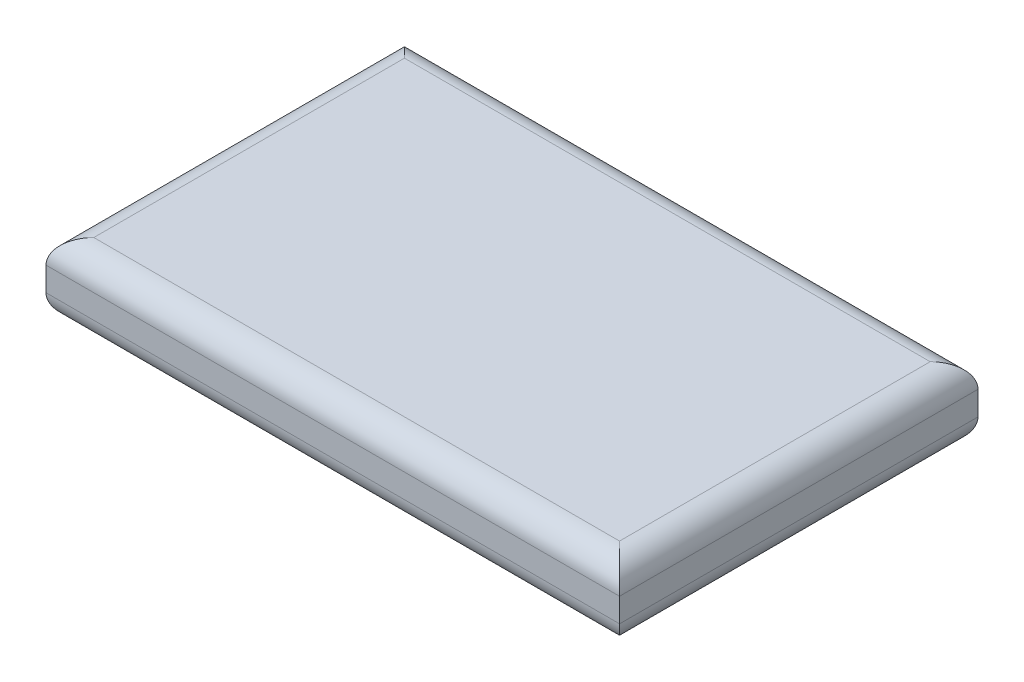
ISO-10303-21;
HEADER;
FILE_DESCRIPTION(('STEP AP214'),'2;1');
FILE_NAME('part.step','',(''),(''),'','','');
FILE_SCHEMA(('AUTOMOTIVE_DESIGN { 1 0 10303 214 1 1 1 1 }'));
ENDSEC;
DATA;
#1=APPLICATION_CONTEXT('core data for automotive mechanical design processes');
#2=APPLICATION_PROTOCOL_DEFINITION('international standard','automotive_design',2000,#1);
#3=PRODUCT_CONTEXT('',#1,'mechanical');
#4=PRODUCT('Part','Part','',(#3));
#5=PRODUCT_RELATED_PRODUCT_CATEGORY('part','',(#4));
#6=PRODUCT_DEFINITION_FORMATION('','',#4);
#7=PRODUCT_DEFINITION_CONTEXT('part definition',#1,'design');
#8=PRODUCT_DEFINITION('design','',#6,#7);
#9=PRODUCT_DEFINITION_SHAPE('','',#8);
#10=(LENGTH_UNIT() NAMED_UNIT(*) SI_UNIT(.MILLI.,.METRE.));
#11=(NAMED_UNIT(*) PLANE_ANGLE_UNIT() SI_UNIT($,.RADIAN.));
#12=(NAMED_UNIT(*) SI_UNIT($,.STERADIAN.) SOLID_ANGLE_UNIT());
#13=UNCERTAINTY_MEASURE_WITH_UNIT(LENGTH_MEASURE(1.E-05),#10,'distance_accuracy_value','');
#14=(GEOMETRIC_REPRESENTATION_CONTEXT(3) GLOBAL_UNCERTAINTY_ASSIGNED_CONTEXT((#13)) GLOBAL_UNIT_ASSIGNED_CONTEXT((#10,
#11,#12)) REPRESENTATION_CONTEXT('',''));
#15=CARTESIAN_POINT('',(0.,0.,0.));
#16=DIRECTION('',(0.,0.,1.));
#17=DIRECTION('',(1.,0.,0.));
#18=AXIS2_PLACEMENT_3D('',#15,#16,#17);
#19=CARTESIAN_POINT('',(24.1258100601357,6.,15.870928548737));
#20=DIRECTION('',(-1.,0.,0.));
#21=DIRECTION('',(0.,0.,1.));
#22=AXIS2_PLACEMENT_3D('',#19,#20,#21);
#23=PLANE('',#22);
#24=DIRECTION('',(0.,-1.,0.));
#25=VECTOR('',#24,1.);
#26=CARTESIAN_POINT('',(24.1258100601357,6.,15.870928548737));
#27=LINE('',#26,#25);
#28=CARTESIAN_POINT('',(24.1258100601357,4.,15.870928548737));
#29=VERTEX_POINT('',#28);
#30=CARTESIAN_POINT('',(24.1258100601357,2.,15.870928548737));
#31=VERTEX_POINT('',#30);
#32=EDGE_CURVE('E142',#29,#31,#27,.T.);
#33=ORIENTED_EDGE('',*,*,#32,.T.);
#34=DIRECTION('',(0.,0.,-1.));
#35=VECTOR('',#34,1.);
#36=CARTESIAN_POINT('',(24.1258100601357,2.,15.870928548737));
#37=LINE('',#36,#35);
#38=CARTESIAN_POINT('',(24.1258100601357,2.,-14.129071451263));
#39=VERTEX_POINT('',#38);
#40=EDGE_CURVE('E151',#31,#39,#37,.T.);
#41=ORIENTED_EDGE('',*,*,#40,.T.);
#42=DIRECTION('',(0.,-1.,0.));
#43=VECTOR('',#42,1.);
#44=CARTESIAN_POINT('',(24.1258100601357,6.,-14.129071451263));
#45=LINE('',#44,#43);
#46=CARTESIAN_POINT('',(24.1258100601357,4.,-14.129071451263));
#47=VERTEX_POINT('',#46);
#48=EDGE_CURVE('E120',#47,#39,#45,.T.);
#49=ORIENTED_EDGE('',*,*,#48,.F.);
#50=DIRECTION('',(0.,0.,-1.));
#51=VECTOR('',#50,1.);
#52=CARTESIAN_POINT('',(24.1258100601357,4.,15.870928548737));
#53=LINE('',#52,#51);
#54=EDGE_CURVE('E153',#47,#29,#53,.F.);
#55=ORIENTED_EDGE('',*,*,#54,.T.);
#56=EDGE_LOOP('',(#33,#41,#49,#55));
#57=FACE_BOUND('',#56,.T.);
#58=ADVANCED_FACE('F33',(#57),#23,.F.);
#59=CARTESIAN_POINT('',(24.1258100601357,6.,-14.129071451263));
#60=DIRECTION('',(0.,0.,1.));
#61=DIRECTION('',(1.,0.,0.));
#62=AXIS2_PLACEMENT_3D('',#59,#60,#61);
#63=PLANE('',#62);
#64=ORIENTED_EDGE('',*,*,#48,.T.);
#65=DIRECTION('',(-1.,0.,0.));
#66=VECTOR('',#65,1.);
#67=CARTESIAN_POINT('',(24.1258100601357,2.,-14.129071451263));
#68=LINE('',#67,#66);
#69=CARTESIAN_POINT('',(-23.8741899398643,2.,-14.129071451263));
#70=VERTEX_POINT('',#69);
#71=EDGE_CURVE('E119',#39,#70,#68,.T.);
#72=ORIENTED_EDGE('',*,*,#71,.T.);
#73=DIRECTION('',(0.,-1.,0.));
#74=VECTOR('',#73,1.);
#75=CARTESIAN_POINT('',(-23.8741899398643,6.,-14.129071451263));
#76=LINE('',#75,#74);
#77=CARTESIAN_POINT('',(-23.8741899398643,4.,-14.129071451263));
#78=VERTEX_POINT('',#77);
#79=EDGE_CURVE('E102',#78,#70,#76,.T.);
#80=ORIENTED_EDGE('',*,*,#79,.F.);
#81=DIRECTION('',(-1.,0.,0.));
#82=VECTOR('',#81,1.);
#83=CARTESIAN_POINT('',(24.1258100601357,4.,-14.129071451263));
#84=LINE('',#83,#82);
#85=EDGE_CURVE('E116',#78,#47,#84,.F.);
#86=ORIENTED_EDGE('',*,*,#85,.T.);
#87=EDGE_LOOP('',(#64,#72,#80,#86));
#88=FACE_BOUND('',#87,.T.);
#89=ADVANCED_FACE('F115',(#88),#63,.F.);
#90=CARTESIAN_POINT('',(-23.8741899398643,6.,15.870928548737));
#91=DIRECTION('',(1.,0.,0.));
#92=DIRECTION('',(0.,0.,-1.));
#93=AXIS2_PLACEMENT_3D('',#90,#91,#92);
#94=PLANE('',#93);
#95=ORIENTED_EDGE('',*,*,#79,.T.);
#96=DIRECTION('',(0.,0.,1.));
#97=VECTOR('',#96,1.);
#98=CARTESIAN_POINT('',(-23.8741899398643,2.,15.870928548737));
#99=LINE('',#98,#97);
#100=CARTESIAN_POINT('',(-23.8741899398643,2.,15.870928548737));
#101=VERTEX_POINT('',#100);
#102=EDGE_CURVE('E108',#70,#101,#99,.T.);
#103=ORIENTED_EDGE('',*,*,#102,.T.);
#104=DIRECTION('',(0.,-1.,0.));
#105=VECTOR('',#104,1.);
#106=CARTESIAN_POINT('',(-23.8741899398643,6.,15.870928548737));
#107=LINE('',#106,#105);
#108=CARTESIAN_POINT('',(-23.8741899398643,4.,15.870928548737));
#109=VERTEX_POINT('',#108);
#110=EDGE_CURVE('E104',#109,#101,#107,.T.);
#111=ORIENTED_EDGE('',*,*,#110,.F.);
#112=DIRECTION('',(0.,0.,1.));
#113=VECTOR('',#112,1.);
#114=CARTESIAN_POINT('',(-23.8741899398643,4.,-14.129071451263));
#115=LINE('',#114,#113);
#116=EDGE_CURVE('E99',#109,#78,#115,.F.);
#117=ORIENTED_EDGE('',*,*,#116,.T.);
#118=EDGE_LOOP('',(#95,#103,#111,#117));
#119=FACE_BOUND('',#118,.T.);
#120=ADVANCED_FACE('F101',(#119),#94,.F.);
#121=CARTESIAN_POINT('',(24.1258100601357,6.,15.870928548737));
#122=DIRECTION('',(0.,0.,-1.));
#123=DIRECTION('',(-1.,0.,0.));
#124=AXIS2_PLACEMENT_3D('',#121,#122,#123);
#125=PLANE('',#124);
#126=ORIENTED_EDGE('',*,*,#110,.T.);
#127=DIRECTION('',(1.,0.,0.));
#128=VECTOR('',#127,1.);
#129=CARTESIAN_POINT('',(24.1258100601357,2.,15.870928548737));
#130=LINE('',#129,#128);
#131=EDGE_CURVE('E155',#101,#31,#130,.T.);
#132=ORIENTED_EDGE('',*,*,#131,.T.);
#133=ORIENTED_EDGE('',*,*,#32,.F.);
#134=DIRECTION('',(1.,0.,0.));
#135=VECTOR('',#134,1.);
#136=CARTESIAN_POINT('',(-23.8741899398643,4.,15.870928548737));
#137=LINE('',#136,#135);
#138=EDGE_CURVE('E157',#29,#109,#137,.F.);
#139=ORIENTED_EDGE('',*,*,#138,.T.);
#140=EDGE_LOOP('',(#126,#132,#133,#139));
#141=FACE_BOUND('',#140,.T.);
#142=ADVANCED_FACE('F195',(#141),#125,.F.);
#143=CARTESIAN_POINT('',(0.,6.,0.));
#144=DIRECTION('',(0.,1.,0.));
#145=DIRECTION('',(0.,0.,1.));
#146=AXIS2_PLACEMENT_3D('',#143,#144,#145);
#147=PLANE('',#146);
#148=DIRECTION('',(0.,0.,1.));
#149=VECTOR('',#148,1.);
#150=CARTESIAN_POINT('',(-21.8741899398643,6.,15.870928548737));
#151=LINE('',#150,#149);
#152=CARTESIAN_POINT('',(-21.8741899398643,6.,-12.129071451263));
#153=VERTEX_POINT('',#152);
#154=CARTESIAN_POINT('',(-21.8741899398643,6.,13.870928548737));
#155=VERTEX_POINT('',#154);
#156=EDGE_CURVE('E42',#153,#155,#151,.T.);
#157=ORIENTED_EDGE('',*,*,#156,.T.);
#158=DIRECTION('',(1.,0.,0.));
#159=VECTOR('',#158,1.);
#160=CARTESIAN_POINT('',(24.1258100601357,6.,13.870928548737));
#161=LINE('',#160,#159);
#162=CARTESIAN_POINT('',(22.1258100601357,6.,13.870928548737));
#163=VERTEX_POINT('',#162);
#164=EDGE_CURVE('E11',#155,#163,#161,.T.);
#165=ORIENTED_EDGE('',*,*,#164,.T.);
#166=DIRECTION('',(0.,0.,-1.));
#167=VECTOR('',#166,1.);
#168=CARTESIAN_POINT('',(22.1258100601357,6.,-14.129071451263));
#169=LINE('',#168,#167);
#170=CARTESIAN_POINT('',(22.1258100601357,6.,-12.129071451263));
#171=VERTEX_POINT('',#170);
#172=EDGE_CURVE('E149',#163,#171,#169,.T.);
#173=ORIENTED_EDGE('',*,*,#172,.T.);
#174=DIRECTION('',(-1.,0.,0.));
#175=VECTOR('',#174,1.);
#176=CARTESIAN_POINT('',(-23.8741899398643,6.,-12.129071451263));
#177=LINE('',#176,#175);
#178=EDGE_CURVE('E53',#171,#153,#177,.T.);
#179=ORIENTED_EDGE('',*,*,#178,.T.);
#180=EDGE_LOOP('',(#157,#165,#173,#179));
#181=FACE_BOUND('',#180,.T.);
#182=ADVANCED_FACE('F201',(#181),#147,.T.);
#183=CARTESIAN_POINT('',(0.,0.,0.));
#184=DIRECTION('',(0.,1.,0.));
#185=DIRECTION('',(0.,0.,1.));
#186=AXIS2_PLACEMENT_3D('',#183,#184,#185);
#187=PLANE('',#186);
#188=DIRECTION('',(0.,0.,1.));
#189=VECTOR('',#188,1.);
#190=CARTESIAN_POINT('',(-21.8741899398643,0.,0.));
#191=LINE('',#190,#189);
#192=CARTESIAN_POINT('',(-21.8741899398643,0.,13.870928548737));
#193=VERTEX_POINT('',#192);
#194=CARTESIAN_POINT('',(-21.8741899398643,0.,-12.129071451263));
#195=VERTEX_POINT('',#194);
#196=EDGE_CURVE('E162',#193,#195,#191,.F.);
#197=ORIENTED_EDGE('',*,*,#196,.T.);
#198=DIRECTION('',(-1.,0.,0.));
#199=VECTOR('',#198,1.);
#200=CARTESIAN_POINT('',(0.,0.,-12.129071451263));
#201=LINE('',#200,#199);
#202=CARTESIAN_POINT('',(22.1258100601357,0.,-12.129071451263));
#203=VERTEX_POINT('',#202);
#204=EDGE_CURVE('E109',#195,#203,#201,.F.);
#205=ORIENTED_EDGE('',*,*,#204,.T.);
#206=DIRECTION('',(0.,0.,-1.));
#207=VECTOR('',#206,1.);
#208=CARTESIAN_POINT('',(22.1258100601357,0.,0.));
#209=LINE('',#208,#207);
#210=CARTESIAN_POINT('',(22.1258100601357,0.,13.870928548737));
#211=VERTEX_POINT('',#210);
#212=EDGE_CURVE('E166',#203,#211,#209,.F.);
#213=ORIENTED_EDGE('',*,*,#212,.T.);
#214=DIRECTION('',(1.,0.,0.));
#215=VECTOR('',#214,1.);
#216=CARTESIAN_POINT('',(0.,0.,13.870928548737));
#217=LINE('',#216,#215);
#218=EDGE_CURVE('E164',#211,#193,#217,.F.);
#219=ORIENTED_EDGE('',*,*,#218,.T.);
#220=EDGE_LOOP('',(#197,#205,#213,#219));
#221=FACE_BOUND('',#220,.T.);
#222=ADVANCED_FACE('F203',(#221),#187,.F.);
#223=CARTESIAN_POINT('',(24.1258100601357,2.,13.870928548737));
#224=DIRECTION('',(1.,0.,0.));
#225=DIRECTION('',(0.,0.,-1.));
#226=AXIS2_PLACEMENT_3D('',#223,#224,#225);
#227=CYLINDRICAL_SURFACE('',#226,2.);
#228=CARTESIAN_POINT('',(-21.8741899398643,2.,13.870928548737));
#229=DIRECTION('',(0.707106781186547,0.,0.707106781186548));
#230=DIRECTION('',(0.707106781186548,0.,-0.707106781186547));
#231=AXIS2_PLACEMENT_3D('',#228,#229,#230);
#232=ELLIPSE('',#231,2.82842712474619,2.);
#233=EDGE_CURVE('E143',#193,#101,#232,.F.);
#234=ORIENTED_EDGE('',*,*,#233,.F.);
#235=ORIENTED_EDGE('',*,*,#218,.F.);
#236=CARTESIAN_POINT('',(22.1258100601357,2.,13.870928548737));
#237=DIRECTION('',(0.707106781186547,0.,-0.707106781186547));
#238=DIRECTION('',(-0.707106781186547,0.,-0.707106781186547));
#239=AXIS2_PLACEMENT_3D('',#236,#237,#238);
#240=ELLIPSE('',#239,2.82842712474619,2.);
#241=EDGE_CURVE('E139',#31,#211,#240,.T.);
#242=ORIENTED_EDGE('',*,*,#241,.F.);
#243=ORIENTED_EDGE('',*,*,#131,.F.);
#244=EDGE_LOOP('',(#234,#235,#242,#243));
#245=FACE_BOUND('',#244,.T.);
#246=ADVANCED_FACE('F182',(#245),#227,.T.);
#247=CARTESIAN_POINT('',(22.1258100601357,2.,15.870928548737));
#248=DIRECTION('',(0.,0.,-1.));
#249=DIRECTION('',(-1.,0.,0.));
#250=AXIS2_PLACEMENT_3D('',#247,#248,#249);
#251=CYLINDRICAL_SURFACE('',#250,2.);
#252=ORIENTED_EDGE('',*,*,#241,.T.);
#253=ORIENTED_EDGE('',*,*,#212,.F.);
#254=CARTESIAN_POINT('',(22.1258100601357,2.,-12.129071451263));
#255=DIRECTION('',(-0.707106781186548,0.,-0.707106781186547));
#256=DIRECTION('',(0.707106781186547,0.,-0.707106781186547));
#257=AXIS2_PLACEMENT_3D('',#254,#255,#256);
#258=ELLIPSE('',#257,2.82842712474619,2.);
#259=EDGE_CURVE('E130',#39,#203,#258,.T.);
#260=ORIENTED_EDGE('',*,*,#259,.F.);
#261=ORIENTED_EDGE('',*,*,#40,.F.);
#262=EDGE_LOOP('',(#252,#253,#260,#261));
#263=FACE_BOUND('',#262,.T.);
#264=ADVANCED_FACE('F186',(#263),#251,.T.);
#265=CARTESIAN_POINT('',(-21.8741899398643,2.,15.870928548737));
#266=DIRECTION('',(0.,0.,1.));
#267=DIRECTION('',(1.,0.,0.));
#268=AXIS2_PLACEMENT_3D('',#265,#266,#267);
#269=CYLINDRICAL_SURFACE('',#268,2.);
#270=ORIENTED_EDGE('',*,*,#233,.T.);
#271=ORIENTED_EDGE('',*,*,#102,.F.);
#272=CARTESIAN_POINT('',(-21.8741899398643,2.,-12.129071451263));
#273=DIRECTION('',(-0.707106781186548,0.,0.707106781186547));
#274=DIRECTION('',(0.707106781186547,0.,0.707106781186547));
#275=AXIS2_PLACEMENT_3D('',#272,#273,#274);
#276=ELLIPSE('',#275,2.82842712474619,2.);
#277=EDGE_CURVE('E129',#195,#70,#276,.F.);
#278=ORIENTED_EDGE('',*,*,#277,.F.);
#279=ORIENTED_EDGE('',*,*,#196,.F.);
#280=EDGE_LOOP('',(#270,#271,#278,#279));
#281=FACE_BOUND('',#280,.T.);
#282=ADVANCED_FACE('F194',(#281),#269,.T.);
#283=CARTESIAN_POINT('',(24.1258100601357,2.,-12.129071451263));
#284=DIRECTION('',(-1.,0.,0.));
#285=DIRECTION('',(0.,0.,1.));
#286=AXIS2_PLACEMENT_3D('',#283,#284,#285);
#287=CYLINDRICAL_SURFACE('',#286,2.);
#288=ORIENTED_EDGE('',*,*,#259,.T.);
#289=ORIENTED_EDGE('',*,*,#204,.F.);
#290=ORIENTED_EDGE('',*,*,#277,.T.);
#291=ORIENTED_EDGE('',*,*,#71,.F.);
#292=EDGE_LOOP('',(#288,#289,#290,#291));
#293=FACE_BOUND('',#292,.T.);
#294=ADVANCED_FACE('F189',(#293),#287,.T.);
#295=CARTESIAN_POINT('',(0.,4.,-12.129071451263));
#296=DIRECTION('',(1.,0.,0.));
#297=DIRECTION('',(0.,0.,-1.));
#298=AXIS2_PLACEMENT_3D('',#295,#296,#297);
#299=CYLINDRICAL_SURFACE('',#298,2.);
#300=CARTESIAN_POINT('',(22.1258100601357,4.,-12.129071451263));
#301=DIRECTION('',(0.707106781186548,0.,0.707106781186547));
#302=DIRECTION('',(-0.707106781186547,0.,0.707106781186547));
#303=AXIS2_PLACEMENT_3D('',#300,#301,#302);
#304=ELLIPSE('',#303,2.82842712474619,2.);
#305=EDGE_CURVE('E125',#47,#171,#304,.T.);
#306=ORIENTED_EDGE('',*,*,#305,.F.);
#307=ORIENTED_EDGE('',*,*,#85,.F.);
#308=CARTESIAN_POINT('',(-21.8741899398643,4.,-12.129071451263));
#309=DIRECTION('',(0.707106781186548,0.,-0.707106781186547));
#310=DIRECTION('',(0.707106781186547,0.,0.707106781186547));
#311=AXIS2_PLACEMENT_3D('',#308,#309,#310);
#312=ELLIPSE('',#311,2.82842712474619,2.);
#313=EDGE_CURVE('E37',#153,#78,#312,.F.);
#314=ORIENTED_EDGE('',*,*,#313,.F.);
#315=ORIENTED_EDGE('',*,*,#178,.F.);
#316=EDGE_LOOP('',(#306,#307,#314,#315));
#317=FACE_BOUND('',#316,.T.);
#318=ADVANCED_FACE('F35',(#317),#299,.T.);
#319=CARTESIAN_POINT('',(-21.8741899398643,4.,0.));
#320=DIRECTION('',(0.,0.,-1.));
#321=DIRECTION('',(-1.,0.,0.));
#322=AXIS2_PLACEMENT_3D('',#319,#320,#321);
#323=CYLINDRICAL_SURFACE('',#322,2.);
#324=ORIENTED_EDGE('',*,*,#313,.T.);
#325=ORIENTED_EDGE('',*,*,#116,.F.);
#326=CARTESIAN_POINT('',(-21.8741899398643,4.,13.870928548737));
#327=DIRECTION('',(-0.707106781186547,0.,-0.707106781186548));
#328=DIRECTION('',(0.707106781186548,0.,-0.707106781186547));
#329=AXIS2_PLACEMENT_3D('',#326,#327,#328);
#330=ELLIPSE('',#329,2.82842712474619,2.);
#331=EDGE_CURVE('E132',#155,#109,#330,.F.);
#332=ORIENTED_EDGE('',*,*,#331,.F.);
#333=ORIENTED_EDGE('',*,*,#156,.F.);
#334=EDGE_LOOP('',(#324,#325,#332,#333));
#335=FACE_BOUND('',#334,.T.);
#336=ADVANCED_FACE('F128',(#335),#323,.T.);
#337=CARTESIAN_POINT('',(22.1258100601357,4.,0.));
#338=DIRECTION('',(0.,0.,1.));
#339=DIRECTION('',(1.,0.,0.));
#340=AXIS2_PLACEMENT_3D('',#337,#338,#339);
#341=CYLINDRICAL_SURFACE('',#340,2.);
#342=ORIENTED_EDGE('',*,*,#305,.T.);
#343=ORIENTED_EDGE('',*,*,#172,.F.);
#344=CARTESIAN_POINT('',(22.1258100601357,4.,13.870928548737));
#345=DIRECTION('',(-0.707106781186547,0.,0.707106781186547));
#346=DIRECTION('',(0.707106781186547,0.,0.707106781186547));
#347=AXIS2_PLACEMENT_3D('',#344,#345,#346);
#348=ELLIPSE('',#347,2.82842712474619,2.);
#349=EDGE_CURVE('E135',#29,#163,#348,.T.);
#350=ORIENTED_EDGE('',*,*,#349,.F.);
#351=ORIENTED_EDGE('',*,*,#54,.F.);
#352=EDGE_LOOP('',(#342,#343,#350,#351));
#353=FACE_BOUND('',#352,.T.);
#354=ADVANCED_FACE('F200',(#353),#341,.T.);
#355=CARTESIAN_POINT('',(0.,4.,13.870928548737));
#356=DIRECTION('',(-1.,0.,0.));
#357=DIRECTION('',(0.,0.,1.));
#358=AXIS2_PLACEMENT_3D('',#355,#356,#357);
#359=CYLINDRICAL_SURFACE('',#358,2.);
#360=ORIENTED_EDGE('',*,*,#331,.T.);
#361=ORIENTED_EDGE('',*,*,#138,.F.);
#362=ORIENTED_EDGE('',*,*,#349,.T.);
#363=ORIENTED_EDGE('',*,*,#164,.F.);
#364=EDGE_LOOP('',(#360,#361,#362,#363));
#365=FACE_BOUND('',#364,.T.);
#366=ADVANCED_FACE('F198',(#365),#359,.T.);
#367=CLOSED_SHELL('',(#58,#89,#120,#142,#182,#222,#246,#264,#282,#294,#318,#336,#354,#366));
#368=MANIFOLD_SOLID_BREP('B2',#367);
#369=ADVANCED_BREP_SHAPE_REPRESENTATION('',(#18,#368),#14);
#370=SHAPE_DEFINITION_REPRESENTATION(#9,#369);
ENDSEC;
END-ISO-10303-21;
